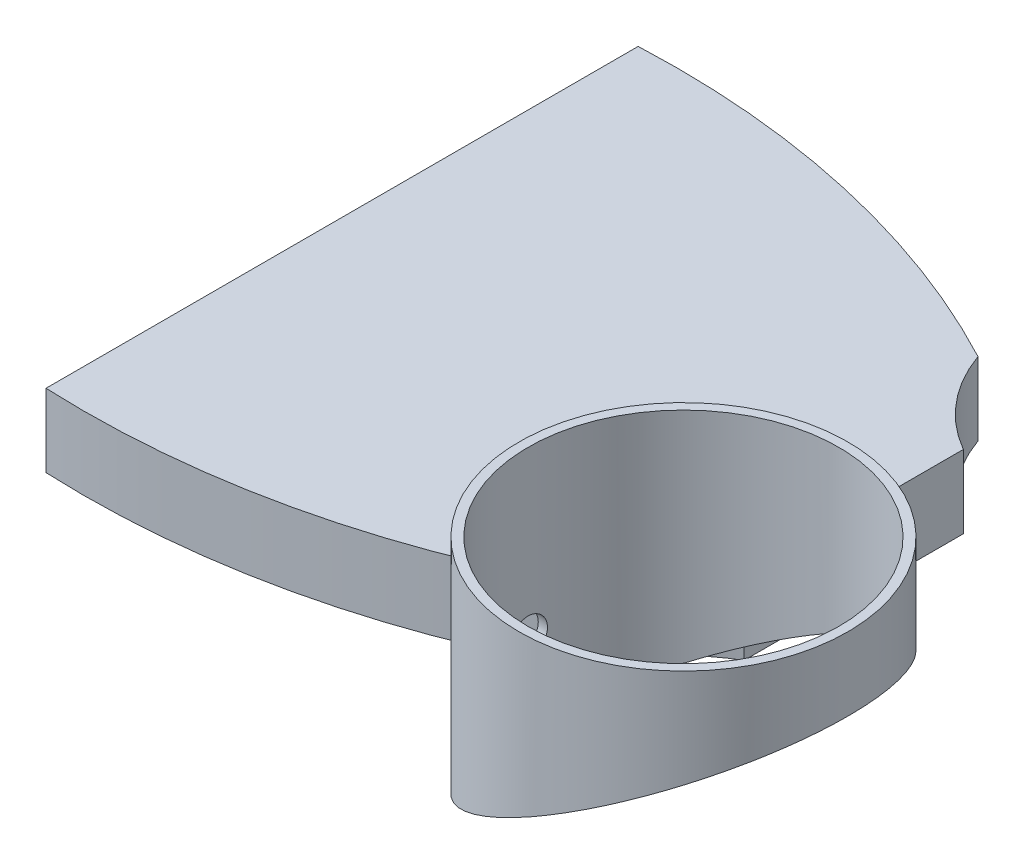
ISO-10303-21;
HEADER;
FILE_DESCRIPTION(('STEP AP214'),'2;1');
FILE_NAME('part.step','',(''),(''),'','','');
FILE_SCHEMA(('AUTOMOTIVE_DESIGN { 1 0 10303 214 1 1 1 1 }'));
ENDSEC;
DATA;
#1=APPLICATION_CONTEXT('core data for automotive mechanical design processes');
#2=APPLICATION_PROTOCOL_DEFINITION('international standard','automotive_design',2000,#1);
#3=PRODUCT_CONTEXT('',#1,'mechanical');
#4=PRODUCT('Part','Part','',(#3));
#5=PRODUCT_RELATED_PRODUCT_CATEGORY('part','',(#4));
#6=PRODUCT_DEFINITION_FORMATION('','',#4);
#7=PRODUCT_DEFINITION_CONTEXT('part definition',#1,'design');
#8=PRODUCT_DEFINITION('design','',#6,#7);
#9=PRODUCT_DEFINITION_SHAPE('','',#8);
#10=(LENGTH_UNIT() NAMED_UNIT(*) SI_UNIT(.MILLI.,.METRE.));
#11=(NAMED_UNIT(*) PLANE_ANGLE_UNIT() SI_UNIT($,.RADIAN.));
#12=(NAMED_UNIT(*) SI_UNIT($,.STERADIAN.) SOLID_ANGLE_UNIT());
#13=UNCERTAINTY_MEASURE_WITH_UNIT(LENGTH_MEASURE(1.E-05),#10,'distance_accuracy_value','');
#14=(GEOMETRIC_REPRESENTATION_CONTEXT(3) GLOBAL_UNCERTAINTY_ASSIGNED_CONTEXT((#13)) GLOBAL_UNIT_ASSIGNED_CONTEXT((#10,
#11,#12)) REPRESENTATION_CONTEXT('',''));
#15=CARTESIAN_POINT('',(0.,0.,0.));
#16=DIRECTION('',(0.,0.,1.));
#17=DIRECTION('',(1.,0.,0.));
#18=AXIS2_PLACEMENT_3D('',#15,#16,#17);
#19=CARTESIAN_POINT('',(0.,60.,0.));
#20=DIRECTION('',(0.,-1.,0.));
#21=DIRECTION('',(0.,0.,-1.));
#22=AXIS2_PLACEMENT_3D('',#19,#20,#21);
#23=CYLINDRICAL_SURFACE('',#22,45.);
#24=CARTESIAN_POINT('',(0.,60.,0.));
#25=DIRECTION('',(0.,1.,0.));
#26=DIRECTION('',(0.,0.,1.));
#27=AXIS2_PLACEMENT_3D('',#24,#25,#26);
#28=CIRCLE('',#27,45.);
#29=CARTESIAN_POINT('',(0.,60.,45.));
#30=VERTEX_POINT('',#29);
#31=EDGE_CURVE('E58',#30,#30,#28,.T.);
#32=ORIENTED_EDGE('',*,*,#31,.F.);
#33=EDGE_LOOP('',(#32));
#34=FACE_BOUND('',#33,.T.);
#35=CARTESIAN_POINT('',(-45.,10.,0.));
#36=CARTESIAN_POINT('',(-45.0000004416612,9.99999852907121,-0.140012636910624));
#37=CARTESIAN_POINT('',(-44.9993452426486,10.0058832310882,-0.280003186803266));
#38=CARTESIAN_POINT('',(-44.9967436952346,10.0293777297651,-0.559029517931079));
#39=CARTESIAN_POINT('',(-44.9947970442554,10.0469902741784,-0.698065067701781));
#40=CARTESIAN_POINT('',(-44.9896647463071,10.0938331013634,-0.974249586798852));
#41=CARTESIAN_POINT('',(-44.9864781387451,10.1230723917487,-1.11139700789713));
#42=CARTESIAN_POINT('',(-44.9789547419868,10.1929659490527,-1.38277351257812));
#43=CARTESIAN_POINT('',(-44.9746175317383,10.2336243950246,-1.51700150832934));
#44=CARTESIAN_POINT('',(-44.9649206615977,10.3260085339011,-1.78140258794814));
#45=CARTESIAN_POINT('',(-44.9595620346445,10.377723052386,-1.91157961508502));
#46=CARTESIAN_POINT('',(-44.9479679173644,10.4918913002321,-2.16715277779527));
#47=CARTESIAN_POINT('',(-44.9417321042897,10.5543489842788,-2.2925471319694));
#48=CARTESIAN_POINT('',(-44.9285637776372,10.6895056362689,-2.537558260248));
#49=CARTESIAN_POINT('',(-44.9216316576524,10.7621988277437,-2.65717824237074));
#50=CARTESIAN_POINT('',(-44.9072591289129,10.9173672927679,-2.88992731456877));
#51=CARTESIAN_POINT('',(-44.8998185326397,10.9998461834809,-3.00305398139991));
#52=CARTESIAN_POINT('',(-44.8846125732511,11.1742948167824,-3.2223722017791));
#53=CARTESIAN_POINT('',(-44.876846151106,11.2662972084444,-3.32853771348095));
#54=CARTESIAN_POINT('',(-44.8612293924613,11.4589380351475,-3.5327885243307));
#55=CARTESIAN_POINT('',(-44.8533790259985,11.5595796505267,-3.63087082155395));
#56=CARTESIAN_POINT('',(-44.8378213773023,11.7687316795166,-3.81819424013519));
#57=CARTESIAN_POINT('',(-44.8301140501066,11.877239565999,-3.9074381793058));
#58=CARTESIAN_POINT('',(-44.8150551076433,12.1014355532039,-4.07652366196106));
#59=CARTESIAN_POINT('',(-44.8077036246707,12.2171262884139,-4.1563617241261));
#60=CARTESIAN_POINT('',(-44.7935520834737,12.4551139076553,-4.30620145542803));
#61=CARTESIAN_POINT('',(-44.7867533180797,12.5774252249234,-4.37618032849247));
#62=CARTESIAN_POINT('',(-44.7739181021192,12.8275921592917,-4.50560635921551));
#63=CARTESIAN_POINT('',(-44.7678819350733,12.9554498148284,-4.56504960320468));
#64=CARTESIAN_POINT('',(-44.7567511118611,13.215722413281,-4.67291975726713));
#65=CARTESIAN_POINT('',(-44.7516560861248,13.3481355430064,-4.72135099329951));
#66=CARTESIAN_POINT('',(-44.7425487444254,13.6166217489664,-4.80688608022317));
#67=CARTESIAN_POINT('',(-44.7385368267454,13.7526961513616,-4.84398576490579));
#68=CARTESIAN_POINT('',(-44.7283464866505,14.163721438442,-4.93752680386368));
#69=CARTESIAN_POINT('',(-44.7239527406909,14.4428514596523,-4.97677903142362));
#70=CARTESIAN_POINT('',(-44.720479155275,15.0036171312376,-5.00788936426347));
#71=CARTESIAN_POINT('',(-44.721399145359,15.2852527009474,-4.99974898985502));
#72=CARTESIAN_POINT('',(-44.7284216645309,15.8418873805518,-4.93652582702122));
#73=CARTESIAN_POINT('',(-44.734500903676,16.1169106117703,-4.88165399040844));
#74=CARTESIAN_POINT('',(-44.7511230287341,16.6538095934376,-4.72683754287468));
#75=CARTESIAN_POINT('',(-44.7616659876074,16.9156851289066,-4.62689219521676));
#76=CARTESIAN_POINT('',(-44.7860536467436,17.4195302434069,-4.38453987942578));
#77=CARTESIAN_POINT('',(-44.7999055505501,17.6614548217519,-4.24204009899014));
#78=CARTESIAN_POINT('',(-44.8293446699477,18.1180343451227,-3.91868933964139));
#79=CARTESIAN_POINT('',(-44.8449319482737,18.3326883036965,-3.73783697404294));
#80=CARTESIAN_POINT('',(-44.8761892274126,18.7298599018137,-3.34174035261886));
#81=CARTESIAN_POINT('',(-44.8918592160177,18.9121959972698,-3.12631400888341));
#82=CARTESIAN_POINT('',(-44.9214364267604,19.238145969973,-2.6678145551897));
#83=CARTESIAN_POINT('',(-44.9353436461486,19.381759786825,-2.42474140211156));
#84=CARTESIAN_POINT('',(-44.9598345258578,19.6261844077003,-1.91771658741945));
#85=CARTESIAN_POINT('',(-44.9704174009803,19.7269851013888,-1.65376001161613));
#86=CARTESIAN_POINT('',(-44.9870596124781,19.882784438653,-1.11252438948652));
#87=CARTESIAN_POINT('',(-44.9931191159812,19.9377847744498,-0.835245835778014));
#88=CARTESIAN_POINT('',(-45.0000102766453,20.0001897543097,-0.276808329603135));
#89=CARTESIAN_POINT('',(-45.0008694299939,20.0078447355917,0.00432232237196117));
#90=CARTESIAN_POINT('',(-44.9973370301359,19.9760005176161,0.563862471573175));
#91=CARTESIAN_POINT('',(-44.9929455648437,19.9365021078789,0.842272014281929));
#92=CARTESIAN_POINT('',(-44.9794227331432,19.8116801532379,1.38773764900356));
#93=CARTESIAN_POINT('',(-44.9703035856962,19.7264747210985,1.65482109803922));
#94=CARTESIAN_POINT('',(-44.9483475089904,19.5127792892871,2.17090567368258));
#95=CARTESIAN_POINT('',(-44.9355104781287,19.3842881066788,2.41990630588722));
#96=CARTESIAN_POINT('',(-44.9074839233716,19.0870543337679,2.89388316891223));
#97=CARTESIAN_POINT('',(-44.8922849387886,18.9181483274097,3.11875635135409));
#98=CARTESIAN_POINT('',(-44.8612679026611,18.5451115243976,3.53704956412825));
#99=CARTESIAN_POINT('',(-44.8454498318576,18.3409796312383,3.73046861499751));
#100=CARTESIAN_POINT('',(-44.8148936864623,17.9021926387973,4.08124064659333));
#101=CARTESIAN_POINT('',(-44.8001607527037,17.6674052455277,4.23842863422403));
#102=CARTESIAN_POINT('',(-44.7735244101902,17.1746060695984,4.51113857935445));
#103=CARTESIAN_POINT('',(-44.7616209550307,16.9165946679179,4.62666122019951));
#104=CARTESIAN_POINT('',(-44.7420233765508,16.3852758526755,4.81249399727454));
#105=CARTESIAN_POINT('',(-44.7343203200184,16.1120022743306,4.88290014150772));
#106=CARTESIAN_POINT('',(-44.7239742163901,15.5572673935596,4.97679248985103));
#107=CARTESIAN_POINT('',(-44.7213309868491,15.2758063867241,5.00028038572181));
#108=CARTESIAN_POINT('',(-44.7213742457946,14.8547089093364,4.99985615684383));
#109=CARTESIAN_POINT('',(-44.7220508011389,14.7148331439179,4.99382441930329));
#110=CARTESIAN_POINT('',(-44.7246981962692,14.4361048717168,4.97006507089961));
#111=CARTESIAN_POINT('',(-44.7266685549244,14.2972520039483,4.95234180779243));
#112=CARTESIAN_POINT('',(-44.7318502422882,14.021502837348,4.90531586160289));
#113=CARTESIAN_POINT('',(-44.7350620243742,13.884607272301,4.87600894799446));
#114=CARTESIAN_POINT('',(-44.742632461159,13.6138311254983,4.80604607950358));
#115=CARTESIAN_POINT('',(-44.74699069738,13.4799494629281,4.76539426540012));
#116=CARTESIAN_POINT('',(-44.7567312129614,13.2160778063872,4.67302531605569));
#117=CARTESIAN_POINT('',(-44.7621136355914,13.0860883598315,4.62130663258644));
#118=CARTESIAN_POINT('',(-44.7737470787784,12.8309771731624,4.50720070108272));
#119=CARTESIAN_POINT('',(-44.7799977826853,12.7058536796994,4.44481734040391));
#120=CARTESIAN_POINT('',(-44.7931950174494,12.4612519188882,4.30978897327021));
#121=CARTESIAN_POINT('',(-44.8001417977717,12.3417756981906,4.2371402839975));
#122=CARTESIAN_POINT('',(-44.8145310373409,12.1093877262333,4.08213929178045));
#123=CARTESIAN_POINT('',(-44.8219733167656,11.9964736210716,3.99979050085454));
#124=CARTESIAN_POINT('',(-44.8371898770132,11.7773280995026,3.82545426215242));
#125=CARTESIAN_POINT('',(-44.8449657910389,11.6711378834847,3.7334151613221));
#126=CARTESIAN_POINT('',(-44.8605874074774,11.466918175489,3.54076694752692));
#127=CARTESIAN_POINT('',(-44.8684330834619,11.3688857276151,3.44016096566673));
#128=CARTESIAN_POINT('',(-44.8839804937465,11.1815677803993,3.23099013971157));
#129=CARTESIAN_POINT('',(-44.8916821378841,11.092287620745,3.12242050680871));
#130=CARTESIAN_POINT('',(-44.9067165230419,10.9232022462089,2.89817729888031));
#131=CARTESIAN_POINT('',(-44.9140493992569,10.8433935441655,2.78250636233133));
#132=CARTESIAN_POINT('',(-44.9281666797047,10.6935224988828,2.54442616631822));
#133=CARTESIAN_POINT('',(-44.9349491215643,10.6234944359472,2.42199520647085));
#134=CARTESIAN_POINT('',(-44.9477423709131,10.4940380054025,2.17167109307515));
#135=CARTESIAN_POINT('',(-44.953753460974,10.4346057530717,2.04377996278183));
#136=CARTESIAN_POINT('',(-44.9648314452149,10.3267844262397,1.78350217972637));
#137=CARTESIAN_POINT('',(-44.9698990968291,10.2783864858289,1.65111923503471));
#138=CARTESIAN_POINT('',(-44.9789509899534,10.1929393180195,1.3827509107644));
#139=CARTESIAN_POINT('',(-44.9829354931546,10.1558873491353,1.24676641005823));
#140=CARTESIAN_POINT('',(-44.9908037467272,10.0832792413274,0.927675121971592));
#141=CARTESIAN_POINT('',(-44.9942383532676,10.0520804210519,0.743548696077162));
#142=CARTESIAN_POINT('',(-44.9988361797136,10.0104418357132,0.37293511603976));
#143=CARTESIAN_POINT('',(-44.9999994118614,10.0000019587639,0.186447974625986));
#144=CARTESIAN_POINT('',(-45.,10.,0.));
#145=B_SPLINE_CURVE_WITH_KNOTS('',3,(#35,#36,#37,#38,#39,#40,#41,#42,#43,#44,#45,#46,#47,#48,
#49,#50,#51,#52,#53,#54,#55,#56,#57,#58,#59,#60,#61,#62,#63,#64,#65,#66,#67,#68,#69,#70,#71,#72,
#73,#74,#75,#76,#77,#78,#79,#80,#81,#82,#83,#84,#85,#86,#87,#88,#89,#90,#91,#92,#93,#94,#95,#96,
#97,#98,#99,#100,#101,#102,#103,#104,#105,#106,#107,#108,#109,#110,#111,#112,#113,#114,#115,
#116,#117,#118,#119,#120,#121,#122,#123,#124,#125,#126,#127,#128,#129,#130,#131,#132,#133,#134,
#135,#136,#137,#138,#139,#140,#141,#142,#143,#144),.UNSPECIFIED.,.T.,.F.,(4,2,2,2,2,2,2,2,2,2,2,
2,2,2,2,2,2,2,2,2,2,2,2,2,2,2,2,2,2,2,2,2,2,2,2,2,2,2,2,2,2,2,2,2,2,2,2,2,2,2,2,2,2,2,4),(0.,
0.41987481829662,0.839848045022893,1.26014727440732,1.68060052102156,2.10063080594254,
2.5208160411468,2.94076508578326,3.36086984589864,3.78246578872655,4.20421760382031,
4.62583452175303,5.04760700225985,5.47033922466448,5.89322815175274,6.31595066294845,
6.73882840761834,7.58016735174106,8.42147930662271,9.25901347981325,10.0965613431895,
10.9359494295602,11.7753678702254,12.6193617595672,13.4633569652789,14.3075513701001,
15.1517145824375,15.9914104629951,16.8310922841679,17.66861464022,18.5061598863916,
19.347150718426,20.1881677334044,21.0329421601813,21.8777027313453,22.7206596275383,
23.5635861281585,23.9831999720009,24.4026578609249,24.8222690840369,25.2417273529639,
25.6612443414984,26.0806087376961,26.5001239700419,26.9194877769007,27.3412124872969,
27.7627837179529,28.1846105651303,28.6062816208648,29.0293953767476,29.4523536868118,
29.8749709488432,30.2974860146831,30.8566157699454,31.4157425116111),.UNSPECIFIED.);
#146=CARTESIAN_POINT('',(-45.,10.,0.));
#147=VERTEX_POINT('',#146);
#148=EDGE_CURVE('E185',#147,#147,#145,.T.);
#149=ORIENTED_EDGE('',*,*,#148,.T.);
#150=EDGE_LOOP('',(#149));
#151=FACE_BOUND('',#150,.T.);
#152=DIRECTION('',(0.,-1.,0.));
#153=VECTOR('',#152,1.);
#154=CARTESIAN_POINT('',(-22.4264068711929,20.,-39.0135396349487));
#155=LINE('',#154,#153);
#156=CARTESIAN_POINT('',(-22.4264068711929,20.,-39.0135396349487));
#157=VERTEX_POINT('',#156);
#158=CARTESIAN_POINT('',(-22.4264068711929,4.03924966869714,-39.0135396349487));
#159=VERTEX_POINT('',#158);
#160=EDGE_CURVE('E70',#157,#159,#155,.T.);
#161=ORIENTED_EDGE('',*,*,#160,.F.);
#162=CARTESIAN_POINT('',(3.46944695195361E-13,20.,2.77555756156289E-13));
#163=DIRECTION('',(0.,1.,0.));
#164=DIRECTION('',(0.,0.,1.));
#165=AXIS2_PLACEMENT_3D('',#162,#163,#164);
#166=CIRCLE('',#165,45.0000000000004);
#167=CARTESIAN_POINT('',(-42.4264068711929,20.,-15.));
#168=VERTEX_POINT('',#167);
#169=EDGE_CURVE('E65',#157,#168,#166,.T.);
#170=ORIENTED_EDGE('',*,*,#169,.T.);
#171=DIRECTION('',(0.,-1.,0.));
#172=VECTOR('',#171,1.);
#173=CARTESIAN_POINT('',(-42.4264068711929,20.,-15.));
#174=LINE('',#173,#172);
#175=CARTESIAN_POINT('',(-42.4264068711929,0.,-15.));
#176=VERTEX_POINT('',#175);
#177=EDGE_CURVE('E166',#168,#176,#174,.T.);
#178=ORIENTED_EDGE('',*,*,#177,.T.);
#179=CARTESIAN_POINT('',(0.,0.,0.));
#180=DIRECTION('',(0.,1.,0.));
#181=DIRECTION('',(0.,0.,1.));
#182=AXIS2_PLACEMENT_3D('',#179,#180,#181);
#183=CIRCLE('',#182,45.);
#184=CARTESIAN_POINT('',(-30.,0.,33.5410196624968));
#185=VERTEX_POINT('',#184);
#186=EDGE_CURVE('E230',#176,#185,#183,.T.);
#187=ORIENTED_EDGE('',*,*,#186,.T.);
#188=CARTESIAN_POINT('',(0.,16.,0.));
#189=DIRECTION('',(-0.470588235294118,0.882352941176471,0.));
#190=DIRECTION('',(-0.882352941176471,-0.470588235294118,0.));
#191=AXIS2_PLACEMENT_3D('',#188,#189,#190);
#192=ELLIPSE('',#191,51.,45.);
#193=EDGE_CURVE('E240',#185,#159,#192,.T.);
#194=ORIENTED_EDGE('',*,*,#193,.T.);
#195=EDGE_LOOP('',(#161,#170,#178,#187,#194));
#196=FACE_BOUND('',#195,.T.);
#197=ADVANCED_FACE('F43',(#34,#151,#196),#23,.T.);
#198=CARTESIAN_POINT('',(0.,60.,0.));
#199=DIRECTION('',(0.,1.,0.));
#200=DIRECTION('',(0.,0.,1.));
#201=AXIS2_PLACEMENT_3D('',#198,#199,#200);
#202=PLANE('',#201);
#203=ORIENTED_EDGE('',*,*,#31,.T.);
#204=EDGE_LOOP('',(#203));
#205=FACE_BOUND('',#204,.T.);
#206=CARTESIAN_POINT('',(0.,60.,0.));
#207=DIRECTION('',(0.,1.,0.));
#208=DIRECTION('',(0.,0.,1.));
#209=AXIS2_PLACEMENT_3D('',#206,#207,#208);
#210=CIRCLE('',#209,42.5);
#211=CARTESIAN_POINT('',(0.,60.,42.5));
#212=VERTEX_POINT('',#211);
#213=EDGE_CURVE('E233',#212,#212,#210,.T.);
#214=ORIENTED_EDGE('',*,*,#213,.F.);
#215=EDGE_LOOP('',(#214));
#216=FACE_BOUND('',#215,.T.);
#217=ADVANCED_FACE('F212',(#205,#216),#202,.T.);
#218=CARTESIAN_POINT('',(0.,0.,0.));
#219=DIRECTION('',(0.,1.,0.));
#220=DIRECTION('',(0.,0.,1.));
#221=AXIS2_PLACEMENT_3D('',#218,#219,#220);
#222=PLANE('',#221);
#223=ORIENTED_EDGE('',*,*,#186,.F.);
#224=CARTESIAN_POINT('',(-151.904424287703,0.,-221.402299628935));
#225=DIRECTION('',(0.,1.,0.));
#226=DIRECTION('',(0.,0.,1.));
#227=AXIS2_PLACEMENT_3D('',#224,#225,#226);
#228=CIRCLE('',#227,233.639349403225);
#229=CARTESIAN_POINT('',(-162.426406871193,0.,12.));
#230=VERTEX_POINT('',#229);
#231=EDGE_CURVE('E157',#176,#230,#228,.F.);
#232=ORIENTED_EDGE('',*,*,#231,.T.);
#233=DIRECTION('',(0.,0.,1.));
#234=VECTOR('',#233,1.);
#235=CARTESIAN_POINT('',(-162.426406871193,0.,0.));
#236=LINE('',#235,#234);
#237=CARTESIAN_POINT('',(-162.426406871193,0.,-150.027079269897));
#238=VERTEX_POINT('',#237);
#239=EDGE_CURVE('E170',#238,#230,#236,.T.);
#240=ORIENTED_EDGE('',*,*,#239,.F.);
#241=CARTESIAN_POINT('',(-151.904424287703,0.,83.3752203590376));
#242=DIRECTION('',(0.,-1.,0.));
#243=DIRECTION('',(0.,0.,-1.));
#244=AXIS2_PLACEMENT_3D('',#241,#242,#243);
#245=CIRCLE('',#244,233.639349403225);
#246=CARTESIAN_POINT('',(-42.4264068711929,0.,-123.027079269897));
#247=VERTEX_POINT('',#246);
#248=EDGE_CURVE('E139',#247,#238,#245,.F.);
#249=ORIENTED_EDGE('',*,*,#248,.F.);
#250=CARTESIAN_POINT('',(3.3326247721079E-13,0.,-138.027079269898));
#251=DIRECTION('',(0.,-1.,0.));
#252=DIRECTION('',(0.,0.,-1.));
#253=AXIS2_PLACEMENT_3D('',#250,#251,#252);
#254=CIRCLE('',#253,45.0000000000004);
#255=CARTESIAN_POINT('',(-22.4264068711929,0.,-99.0135396349487));
#256=VERTEX_POINT('',#255);
#257=EDGE_CURVE('E143',#256,#247,#254,.T.);
#258=ORIENTED_EDGE('',*,*,#257,.F.);
#259=DIRECTION('',(0.,0.,-1.));
#260=VECTOR('',#259,1.);
#261=CARTESIAN_POINT('',(-22.4264068711929,0.,0.));
#262=LINE('',#261,#260);
#263=CARTESIAN_POINT('',(-22.4264068711929,0.,-39.0135396349487));
#264=VERTEX_POINT('',#263);
#265=EDGE_CURVE('E150',#264,#256,#262,.T.);
#266=ORIENTED_EDGE('',*,*,#265,.F.);
#267=CARTESIAN_POINT('',(3.46944695195361E-13,0.,2.77555756156289E-13));
#268=DIRECTION('',(0.,1.,0.));
#269=DIRECTION('',(0.,0.,1.));
#270=AXIS2_PLACEMENT_3D('',#267,#268,#269);
#271=CIRCLE('',#270,45.0000000000004);
#272=CARTESIAN_POINT('',(-30.,0.,-33.5410196624968));
#273=VERTEX_POINT('',#272);
#274=EDGE_CURVE('E145',#264,#273,#271,.T.);
#275=ORIENTED_EDGE('',*,*,#274,.T.);
#276=DIRECTION('',(0.,0.,1.));
#277=VECTOR('',#276,1.);
#278=CARTESIAN_POINT('',(-30.,0.,-45.));
#279=LINE('',#278,#277);
#280=CARTESIAN_POINT('',(-30.,0.,-30.1039864469808));
#281=VERTEX_POINT('',#280);
#282=EDGE_CURVE('E249',#273,#281,#279,.T.);
#283=ORIENTED_EDGE('',*,*,#282,.T.);
#284=CARTESIAN_POINT('',(0.,0.,0.));
#285=DIRECTION('',(0.,1.,0.));
#286=DIRECTION('',(0.,0.,1.));
#287=AXIS2_PLACEMENT_3D('',#284,#285,#286);
#288=CIRCLE('',#287,42.5);
#289=CARTESIAN_POINT('',(-30.,0.,30.1039864469808));
#290=VERTEX_POINT('',#289);
#291=EDGE_CURVE('E236',#281,#290,#288,.T.);
#292=ORIENTED_EDGE('',*,*,#291,.T.);
#293=EDGE_CURVE('E192',#290,#185,#279,.T.);
#294=ORIENTED_EDGE('',*,*,#293,.T.);
#295=EDGE_LOOP('',(#223,#232,#240,#249,#258,#266,#275,#283,#292,#294));
#296=FACE_BOUND('',#295,.T.);
#297=ADVANCED_FACE('F210',(#296),#222,.F.);
#298=CARTESIAN_POINT('',(0.,60.,0.));
#299=DIRECTION('',(0.,-1.,0.));
#300=DIRECTION('',(0.,0.,-1.));
#301=AXIS2_PLACEMENT_3D('',#298,#299,#300);
#302=CYLINDRICAL_SURFACE('',#301,42.5);
#303=CARTESIAN_POINT('',(-42.2048575403353,15.,-5.));
#304=CARTESIAN_POINT('',(-42.2048570426154,15.1399529695327,-5.00000153220892));
#305=CARTESIAN_POINT('',(-42.2055550887369,15.2798831778351,-4.99412181150468));
#306=CARTESIAN_POINT('',(-42.2083262928635,15.5587883310332,-4.97064763379723));
#307=CARTESIAN_POINT('',(-42.2103997683703,15.6977630478791,-4.95305047195592));
#308=CARTESIAN_POINT('',(-42.2158651113569,15.9738234923926,-4.90624962764263));
#309=CARTESIAN_POINT('',(-42.2192579831723,16.1109076984782,-4.87703710307672));
#310=CARTESIAN_POINT('',(-42.2272657855913,16.382158010341,-4.80720904071437));
#311=CARTESIAN_POINT('',(-42.2318811637412,16.5163230279302,-4.76658932654084));
#312=CARTESIAN_POINT('',(-42.2421957984114,16.7805965374887,-4.67429629923434));
#313=CARTESIAN_POINT('',(-42.2478939341415,16.9107090636115,-4.62263440929848));
#314=CARTESIAN_POINT('',(-42.2602171284125,17.1661568113775,-4.50858482145079));
#315=CARTESIAN_POINT('',(-42.2668425281619,17.291490252744,-4.44619317333116));
#316=CARTESIAN_POINT('',(-42.2808268333667,17.5363865535805,-4.31118117911138));
#317=CARTESIAN_POINT('',(-42.2881853295911,17.6559525778356,-4.2385665304696));
#318=CARTESIAN_POINT('',(-42.3034341792611,17.8886025109638,-4.08356714245648));
#319=CARTESIAN_POINT('',(-42.3113247290179,18.0016839984524,-4.00117878828372));
#320=CARTESIAN_POINT('',(-42.3274462472034,18.2209804296494,-3.8268763813219));
#321=CARTESIAN_POINT('',(-42.3356784708233,18.3271655422521,-3.73492491108491));
#322=CARTESIAN_POINT('',(-42.3522235943998,18.5314608662332,-3.54238529197751));
#323=CARTESIAN_POINT('',(-42.3605365230633,18.6295680771549,-3.4417939620091));
#324=CARTESIAN_POINT('',(-42.3770029500096,18.8169476105923,-3.2327400377726));
#325=CARTESIAN_POINT('',(-42.3851564983579,18.9062227444844,-3.12427996741562));
#326=CARTESIAN_POINT('',(-42.4010802245308,19.0753771973669,-2.90017539146534));
#327=CARTESIAN_POINT('',(-42.4088502598181,19.1552530380391,-2.78452825025411));
#328=CARTESIAN_POINT('',(-42.4238038287965,19.3051961090869,-2.54658798854196));
#329=CARTESIAN_POINT('',(-42.4309858096712,19.3752376985946,-2.42427860788358));
#330=CARTESIAN_POINT('',(-42.4445399092936,19.504788544097,-2.17410523151314));
#331=CARTESIAN_POINT('',(-42.4509117266968,19.5642938842907,-2.046239192563));
#332=CARTESIAN_POINT('',(-42.4626584772262,19.6722858264464,-1.78593972538157));
#333=CARTESIAN_POINT('',(-42.4680338039206,19.7207767802997,-1.65350812495275));
#334=CARTESIAN_POINT('',(-42.4776407097346,19.8064273509933,-1.38497529059971));
#335=CARTESIAN_POINT('',(-42.4818718683579,19.843582802534,-1.24887272770441));
#336=CARTESIAN_POINT('',(-42.4926156836359,19.9372507235772,-0.837888295604481));
#337=CARTESIAN_POINT('',(-42.4972488852707,19.9765890205591,-0.55882001691362));
#338=CARTESIAN_POINT('',(-42.5009262381868,20.0078876467416,0.00184095790844801));
#339=CARTESIAN_POINT('',(-42.4999705856277,19.9998496387716,0.28343356509356));
#340=CARTESIAN_POINT('',(-42.4926067149132,19.9368598943182,0.839867831812223));
#341=CARTESIAN_POINT('',(-42.4862254763745,19.8821402852264,1.11473598413353));
#342=CARTESIAN_POINT('',(-42.4687553702886,19.7276864897963,1.65134958121404));
#343=CARTESIAN_POINT('',(-42.457666421993,19.6279515313359,1.91309480079767));
#344=CARTESIAN_POINT('',(-42.431981252298,19.3860532401785,2.41676875487328));
#345=CARTESIAN_POINT('',(-42.4173766819814,19.2437887105244,2.6586484506143));
#346=CARTESIAN_POINT('',(-42.3862955734946,18.9209420245672,3.11518667208807));
#347=CARTESIAN_POINT('',(-42.3698189592679,18.7403583111922,3.32984409109713));
#348=CARTESIAN_POINT('',(-42.3367216107521,18.3446974847568,3.72720820997643));
#349=CARTESIAN_POINT('',(-42.3201006079111,18.1294181276069,3.90971357044532));
#350=CARTESIAN_POINT('',(-42.2886865577819,17.6711737026081,4.23602976084424));
#351=CARTESIAN_POINT('',(-42.273893515109,17.4282085648613,4.37984049307937));
#352=CARTESIAN_POINT('',(-42.2478100922406,16.9213179196307,4.6246927745134));
#353=CARTESIAN_POINT('',(-42.236520937282,16.6573851206188,4.72571936747723));
#354=CARTESIAN_POINT('',(-42.2187479144865,16.1161391162741,4.88196314747015));
#355=CARTESIAN_POINT('',(-42.2122638423231,15.8388264804258,4.93718228238001));
#356=CARTESIAN_POINT('',(-42.2048719542076,15.2804675288583,4.99997947193507));
#357=CARTESIAN_POINT('',(-42.2039310360584,14.9994534420448,5.00784034354875));
#358=CARTESIAN_POINT('',(-42.2076445133811,14.440112279476,4.97644297673002));
#359=CARTESIAN_POINT('',(-42.2122988035176,14.1617851532353,4.93718562534562));
#360=CARTESIAN_POINT('',(-42.2266481071554,13.6165587702321,4.81290385798638));
#361=CARTESIAN_POINT('',(-42.2363281472618,13.3496281022682,4.72801536606907));
#362=CARTESIAN_POINT('',(-42.2596261267638,12.8337911527199,4.51502046731315));
#363=CARTESIAN_POINT('',(-42.2732441894599,12.584885435807,4.38691270724616));
#364=CARTESIAN_POINT('',(-42.3029633901479,12.110881296486,4.09041653963718));
#365=CARTESIAN_POINT('',(-42.3190758731951,11.8858999938839,3.92184205071184));
#366=CARTESIAN_POINT('',(-42.351932348192,11.4673238566366,3.54946083559451));
#367=CARTESIAN_POINT('',(-42.3686763618389,11.2737301015622,3.34565289805049));
#368=CARTESIAN_POINT('',(-42.4010105313895,10.9224363779395,2.90736112545498));
#369=CARTESIAN_POINT('',(-42.416594460736,10.7649218250252,2.67272816850211));
#370=CARTESIAN_POINT('',(-42.4447598893091,10.4915398697529,2.18016147643642));
#371=CARTESIAN_POINT('',(-42.4573414430666,10.3756717109716,1.92222816463432));
#372=CARTESIAN_POINT('',(-42.4780582121798,10.1891751658383,1.39106110309958));
#373=CARTESIAN_POINT('',(-42.4862041012418,10.1184381077045,1.11786584287678));
#374=CARTESIAN_POINT('',(-42.4971704503958,10.0238770641048,0.563220067490722));
#375=CARTESIAN_POINT('',(-42.4999911218588,10.0000512166156,0.281769880436246));
#376=CARTESIAN_POINT('',(-42.5000044104807,9.99997457451303,-0.139272338487287));
#377=CARTESIAN_POINT('',(-42.4993128387089,10.0058339061344,-0.279082637609122));
#378=CARTESIAN_POINT('',(-42.4965682638121,10.0292373750966,-0.557694307697613));
#379=CARTESIAN_POINT('',(-42.4945157672281,10.0467771649407,-0.696496034633247));
#380=CARTESIAN_POINT('',(-42.4891038080095,10.0934258747545,-0.972157288315552));
#381=CARTESIAN_POINT('',(-42.4857438695194,10.1225390070309,-1.10901608909763));
#382=CARTESIAN_POINT('',(-42.4778137528201,10.192104838242,-1.37973383027604));
#383=CARTESIAN_POINT('',(-42.4732440157097,10.2325534045331,-1.51359384479053));
#384=CARTESIAN_POINT('',(-42.4630212480011,10.3245044190552,-1.7774307757936));
#385=CARTESIAN_POINT('',(-42.4573681256156,10.3760078039247,-1.9074073621884));
#386=CARTESIAN_POINT('',(-42.4451393043683,10.4896740551361,-2.16251058573238));
#387=CARTESIAN_POINT('',(-42.4385639413194,10.5518330433049,-2.28763896717307));
#388=CARTESIAN_POINT('',(-42.4246699980669,10.6864048841601,-2.53227030447961));
#389=CARTESIAN_POINT('',(-42.4173511491634,10.7588214477462,-2.65177120354272));
#390=CARTESIAN_POINT('',(-42.4021789743024,10.9133522832087,-2.88423002793996));
#391=CARTESIAN_POINT('',(-42.3943258417194,10.9954630542661,-2.9971902934287));
#392=CARTESIAN_POINT('',(-42.3782517246235,11.1693657611161,-3.21651176313942));
#393=CARTESIAN_POINT('',(-42.370028767676,11.2612143597627,-3.32282789929354));
#394=CARTESIAN_POINT('',(-42.3534952931391,11.4534902251104,-3.52731594713733));
#395=CARTESIAN_POINT('',(-42.345184808445,11.5539143631206,-3.62549080353376));
#396=CARTESIAN_POINT('',(-42.328702604096,11.76273247048,-3.8131105744272));
#397=CARTESIAN_POINT('',(-42.3205309715699,11.8711312318957,-3.90255016339666));
#398=CARTESIAN_POINT('',(-42.3045658265566,12.0950467542869,-4.07197125849128));
#399=CARTESIAN_POINT('',(-42.2967721755548,12.2105608720098,-4.15195624501672));
#400=CARTESIAN_POINT('',(-42.2817522990114,12.4483903103198,-4.30222602232548));
#401=CARTESIAN_POINT('',(-42.2745283499737,12.5707298806504,-4.37247266995777));
#402=CARTESIAN_POINT('',(-42.2608909854348,12.8208948943544,-4.5023725561685));
#403=CARTESIAN_POINT('',(-42.2544772729778,12.9487183047295,-4.56202967912646));
#404=CARTESIAN_POINT('',(-42.2426469295632,13.2088868013426,-4.6703048845762));
#405=CARTESIAN_POINT('',(-42.2372295084045,13.3412282045203,-4.71893172286525));
#406=CARTESIAN_POINT('',(-42.2275431744966,13.6095383888401,-4.80483725951314));
#407=CARTESIAN_POINT('',(-42.2232739871718,13.7455062942186,-4.84211867116874));
#408=CARTESIAN_POINT('',(-42.2147996729675,14.0658097545487,-4.91553698263408));
#409=CARTESIAN_POINT('',(-42.211087042827,14.2512068701019,-4.94717868566831));
#410=CARTESIAN_POINT('',(-42.2061163182805,14.6244163248753,-4.98940909889525));
#411=CARTESIAN_POINT('',(-42.2048582081135,14.8122286485791,-4.99999794427413));
#412=CARTESIAN_POINT('',(-42.2048575403353,15.,-5.));
#413=B_SPLINE_CURVE_WITH_KNOTS('',3,(#303,#304,#305,#306,#307,#308,#309,#310,#311,#312,#313,
#314,#315,#316,#317,#318,#319,#320,#321,#322,#323,#324,#325,#326,#327,#328,#329,#330,#331,#332,
#333,#334,#335,#336,#337,#338,#339,#340,#341,#342,#343,#344,#345,#346,#347,#348,#349,#350,#351,
#352,#353,#354,#355,#356,#357,#358,#359,#360,#361,#362,#363,#364,#365,#366,#367,#368,#369,#370,
#371,#372,#373,#374,#375,#376,#377,#378,#379,#380,#381,#382,#383,#384,#385,#386,#387,#388,#389,
#390,#391,#392,#393,#394,#395,#396,#397,#398,#399,#400,#401,#402,#403,#404,#405,#406,#407,#408,
#409,#410,#411,#412),.UNSPECIFIED.,.T.,.F.,(4,2,2,2,2,2,2,2,2,2,2,2,2,2,2,2,2,2,2,2,2,2,2,2,2,2,
2,2,2,2,2,2,2,2,2,2,2,2,2,2,2,2,2,2,2,2,2,2,2,2,2,2,2,2,4),(0.,0.419694606038877,
0.839486127408576,1.25959782511688,1.67986353424059,2.09969656225699,2.51968448583806,
2.93943926258083,3.35934977234266,3.7809699158299,4.20274596602153,4.6243873239399,
5.04618422771718,5.46906123504266,5.89209507638733,6.31496148106452,6.73798308394638,
7.57918339412234,8.42035417974517,9.25736640596016,10.094392989503,10.9334273061514,
11.7724957228746,12.616644888449,13.460796185283,14.3052423326066,15.1496525695169,
15.989015067106,16.8283617630985,17.6652219932154,18.5021084284992,19.3429194974868,
20.1837594799321,21.028828260691,21.873881691694,22.7168925502362,23.5598699468921,
23.9792660026561,24.398506045306,24.8178988171165,25.237138886256,25.6564144902597,
26.075537819033,26.4948131638446,26.9139375584043,27.3356506552624,27.757210546766,
28.1790258620898,28.6006854132215,29.0239524825195,29.4470639694922,29.8698384076192,
30.2925116582232,30.8556088877206,31.4187025014045),.UNSPECIFIED.);
#414=CARTESIAN_POINT('',(-42.2048575403353,15.,-5.));
#415=VERTEX_POINT('',#414);
#416=EDGE_CURVE('E47',#415,#415,#413,.T.);
#417=ORIENTED_EDGE('',*,*,#416,.F.);
#418=EDGE_LOOP('',(#417));
#419=FACE_BOUND('',#418,.T.);
#420=CARTESIAN_POINT('',(0.,16.,0.));
#421=DIRECTION('',(-0.470588235294118,0.882352941176471,0.));
#422=DIRECTION('',(-0.882352941176471,-0.470588235294118,0.));
#423=AXIS2_PLACEMENT_3D('',#420,#421,#422);
#424=ELLIPSE('',#423,48.1666666666667,42.5);
#425=EDGE_CURVE('E11',#290,#281,#424,.T.);
#426=ORIENTED_EDGE('',*,*,#425,.F.);
#427=ORIENTED_EDGE('',*,*,#291,.F.);
#428=EDGE_LOOP('',(#426,#427));
#429=FACE_BOUND('',#428,.T.);
#430=ORIENTED_EDGE('',*,*,#213,.T.);
#431=EDGE_LOOP('',(#430));
#432=FACE_BOUND('',#431,.T.);
#433=ADVANCED_FACE('F205',(#419,#429,#432),#302,.F.);
#434=CARTESIAN_POINT('',(-30.,0.,-45.));
#435=DIRECTION('',(-0.470588235294118,0.882352941176471,0.));
#436=DIRECTION('',(-0.882352941176471,-0.470588235294118,0.));
#437=AXIS2_PLACEMENT_3D('',#434,#435,#436);
#438=PLANE('',#437);
#439=ORIENTED_EDGE('',*,*,#293,.F.);
#440=ORIENTED_EDGE('',*,*,#425,.T.);
#441=ORIENTED_EDGE('',*,*,#282,.F.);
#442=EDGE_CURVE('E244',#159,#273,#192,.T.);
#443=ORIENTED_EDGE('',*,*,#442,.F.);
#444=ORIENTED_EDGE('',*,*,#193,.F.);
#445=EDGE_LOOP('',(#439,#440,#441,#443,#444));
#446=FACE_BOUND('',#445,.T.);
#447=ADVANCED_FACE('F200',(#446),#438,.F.);
#448=CARTESIAN_POINT('',(-45.,15.,0.));
#449=DIRECTION('',(1.,0.,0.));
#450=DIRECTION('',(0.,0.,-1.));
#451=AXIS2_PLACEMENT_3D('',#448,#449,#450);
#452=CYLINDRICAL_SURFACE('',#451,5.);
#453=ORIENTED_EDGE('',*,*,#416,.T.);
#454=EDGE_LOOP('',(#453));
#455=FACE_BOUND('',#454,.T.);
#456=ORIENTED_EDGE('',*,*,#148,.F.);
#457=EDGE_LOOP('',(#456));
#458=FACE_BOUND('',#457,.T.);
#459=ADVANCED_FACE('F194',(#455,#458),#452,.F.);
#460=CARTESIAN_POINT('',(3.46944695195361E-13,20.,2.77555756156289E-13));
#461=DIRECTION('',(0.,-1.,0.));
#462=DIRECTION('',(0.,0.,-1.));
#463=AXIS2_PLACEMENT_3D('',#460,#461,#462);
#464=CYLINDRICAL_SURFACE('',#463,45.0000000000004);
#465=ORIENTED_EDGE('',*,*,#442,.T.);
#466=ORIENTED_EDGE('',*,*,#274,.F.);
#467=EDGE_CURVE('E182',#159,#264,#155,.T.);
#468=ORIENTED_EDGE('',*,*,#467,.F.);
#469=EDGE_LOOP('',(#465,#466,#468));
#470=FACE_BOUND('',#469,.T.);
#471=ADVANCED_FACE('F199',(#470),#464,.F.);
#472=CARTESIAN_POINT('',(-22.4264068711929,20.,0.));
#473=DIRECTION('',(-1.,0.,0.));
#474=DIRECTION('',(0.,0.,1.));
#475=AXIS2_PLACEMENT_3D('',#472,#473,#474);
#476=PLANE('',#475);
#477=ORIENTED_EDGE('',*,*,#265,.T.);
#478=DIRECTION('',(0.,-1.,0.));
#479=VECTOR('',#478,1.);
#480=CARTESIAN_POINT('',(-22.4264068711929,20.,-99.0135396349487));
#481=LINE('',#480,#479);
#482=CARTESIAN_POINT('',(-22.4264068711929,20.,-99.0135396349487));
#483=VERTEX_POINT('',#482);
#484=EDGE_CURVE('E129',#483,#256,#481,.T.);
#485=ORIENTED_EDGE('',*,*,#484,.F.);
#486=DIRECTION('',(0.,0.,-1.));
#487=VECTOR('',#486,1.);
#488=CARTESIAN_POINT('',(-22.4264068711929,20.,0.));
#489=LINE('',#488,#487);
#490=EDGE_CURVE('E134',#157,#483,#489,.T.);
#491=ORIENTED_EDGE('',*,*,#490,.F.);
#492=ORIENTED_EDGE('',*,*,#160,.T.);
#493=ORIENTED_EDGE('',*,*,#467,.T.);
#494=EDGE_LOOP('',(#477,#485,#491,#492,#493));
#495=FACE_BOUND('',#494,.T.);
#496=ADVANCED_FACE('F276',(#495),#476,.F.);
#497=CARTESIAN_POINT('',(-162.426406871193,20.,0.));
#498=DIRECTION('',(1.,0.,0.));
#499=DIRECTION('',(0.,0.,-1.));
#500=AXIS2_PLACEMENT_3D('',#497,#498,#499);
#501=PLANE('',#500);
#502=ORIENTED_EDGE('',*,*,#239,.T.);
#503=DIRECTION('',(0.,-1.,0.));
#504=VECTOR('',#503,1.);
#505=CARTESIAN_POINT('',(-162.426406871193,20.,12.));
#506=LINE('',#505,#504);
#507=CARTESIAN_POINT('',(-162.426406871193,20.,12.));
#508=VERTEX_POINT('',#507);
#509=EDGE_CURVE('E179',#508,#230,#506,.T.);
#510=ORIENTED_EDGE('',*,*,#509,.F.);
#511=DIRECTION('',(0.,0.,1.));
#512=VECTOR('',#511,1.);
#513=CARTESIAN_POINT('',(-162.426406871193,20.,0.));
#514=LINE('',#513,#512);
#515=CARTESIAN_POINT('',(-162.426406871193,20.,-150.027079269897));
#516=VERTEX_POINT('',#515);
#517=EDGE_CURVE('E160',#516,#508,#514,.T.);
#518=ORIENTED_EDGE('',*,*,#517,.F.);
#519=DIRECTION('',(0.,-1.,0.));
#520=VECTOR('',#519,1.);
#521=CARTESIAN_POINT('',(-162.426406871193,20.,-150.027079269897));
#522=LINE('',#521,#520);
#523=EDGE_CURVE('E126',#516,#238,#522,.T.);
#524=ORIENTED_EDGE('',*,*,#523,.T.);
#525=EDGE_LOOP('',(#502,#510,#518,#524));
#526=FACE_BOUND('',#525,.T.);
#527=ADVANCED_FACE('F268',(#526),#501,.F.);
#528=CARTESIAN_POINT('',(-151.904424287703,20.,-221.402299628935));
#529=DIRECTION('',(0.,-1.,0.));
#530=DIRECTION('',(0.,0.,-1.));
#531=AXIS2_PLACEMENT_3D('',#528,#529,#530);
#532=CYLINDRICAL_SURFACE('',#531,233.639349403225);
#533=ORIENTED_EDGE('',*,*,#231,.F.);
#534=ORIENTED_EDGE('',*,*,#177,.F.);
#535=CARTESIAN_POINT('',(-151.904424287703,20.,-221.402299628935));
#536=DIRECTION('',(0.,1.,0.));
#537=DIRECTION('',(0.,0.,1.));
#538=AXIS2_PLACEMENT_3D('',#535,#536,#537);
#539=CIRCLE('',#538,233.639349403225);
#540=EDGE_CURVE('E163',#168,#508,#539,.F.);
#541=ORIENTED_EDGE('',*,*,#540,.T.);
#542=ORIENTED_EDGE('',*,*,#509,.T.);
#543=EDGE_LOOP('',(#533,#534,#541,#542));
#544=FACE_BOUND('',#543,.T.);
#545=ADVANCED_FACE('F264',(#544),#532,.T.);
#546=CARTESIAN_POINT('',(0.,20.,0.));
#547=DIRECTION('',(0.,1.,0.));
#548=DIRECTION('',(0.,0.,1.));
#549=AXIS2_PLACEMENT_3D('',#546,#547,#548);
#550=PLANE('',#549);
#551=ORIENTED_EDGE('',*,*,#169,.F.);
#552=ORIENTED_EDGE('',*,*,#490,.T.);
#553=CARTESIAN_POINT('',(3.3326247721079E-13,20.,-138.027079269898));
#554=DIRECTION('',(0.,-1.,0.));
#555=DIRECTION('',(0.,0.,-1.));
#556=AXIS2_PLACEMENT_3D('',#553,#554,#555);
#557=CIRCLE('',#556,45.0000000000004);
#558=CARTESIAN_POINT('',(-42.4264068711929,20.,-123.027079269897));
#559=VERTEX_POINT('',#558);
#560=EDGE_CURVE('E130',#483,#559,#557,.T.);
#561=ORIENTED_EDGE('',*,*,#560,.T.);
#562=CARTESIAN_POINT('',(-151.904424287703,20.,83.3752203590376));
#563=DIRECTION('',(0.,-1.,0.));
#564=DIRECTION('',(0.,0.,-1.));
#565=AXIS2_PLACEMENT_3D('',#562,#563,#564);
#566=CIRCLE('',#565,233.639349403225);
#567=EDGE_CURVE('E118',#559,#516,#566,.F.);
#568=ORIENTED_EDGE('',*,*,#567,.T.);
#569=ORIENTED_EDGE('',*,*,#517,.T.);
#570=ORIENTED_EDGE('',*,*,#540,.F.);
#571=EDGE_LOOP('',(#551,#552,#561,#568,#569,#570));
#572=FACE_BOUND('',#571,.T.);
#573=ADVANCED_FACE('F133',(#572),#550,.T.);
#574=CARTESIAN_POINT('',(3.3326247721079E-13,20.,-138.027079269898));
#575=DIRECTION('',(0.,-1.,0.));
#576=DIRECTION('',(0.,0.,-1.));
#577=AXIS2_PLACEMENT_3D('',#574,#575,#576);
#578=CYLINDRICAL_SURFACE('',#577,45.0000000000004);
#579=ORIENTED_EDGE('',*,*,#257,.T.);
#580=DIRECTION('',(0.,-1.,0.));
#581=VECTOR('',#580,1.);
#582=CARTESIAN_POINT('',(-42.4264068711929,20.,-123.027079269897));
#583=LINE('',#582,#581);
#584=EDGE_CURVE('E123',#559,#247,#583,.T.);
#585=ORIENTED_EDGE('',*,*,#584,.F.);
#586=ORIENTED_EDGE('',*,*,#560,.F.);
#587=ORIENTED_EDGE('',*,*,#484,.T.);
#588=EDGE_LOOP('',(#579,#585,#586,#587));
#589=FACE_BOUND('',#588,.T.);
#590=ADVANCED_FACE('F141',(#589),#578,.F.);
#591=CARTESIAN_POINT('',(-151.904424287703,20.,83.3752203590376));
#592=DIRECTION('',(0.,-1.,0.));
#593=DIRECTION('',(0.,0.,-1.));
#594=AXIS2_PLACEMENT_3D('',#591,#592,#593);
#595=CYLINDRICAL_SURFACE('',#594,233.639349403225);
#596=ORIENTED_EDGE('',*,*,#248,.T.);
#597=ORIENTED_EDGE('',*,*,#523,.F.);
#598=ORIENTED_EDGE('',*,*,#567,.F.);
#599=ORIENTED_EDGE('',*,*,#584,.T.);
#600=EDGE_LOOP('',(#596,#597,#598,#599));
#601=FACE_BOUND('',#600,.T.);
#602=ADVANCED_FACE('F121',(#601),#595,.T.);
#603=CLOSED_SHELL('',(#197,#217,#297,#433,#447,#459,#471,#496,#527,#545,#573,#590,#602));
#604=MANIFOLD_SOLID_BREP('B2',#603);
#605=ADVANCED_BREP_SHAPE_REPRESENTATION('',(#18,#604),#14);
#606=SHAPE_DEFINITION_REPRESENTATION(#9,#605);
ENDSEC;
END-ISO-10303-21;
